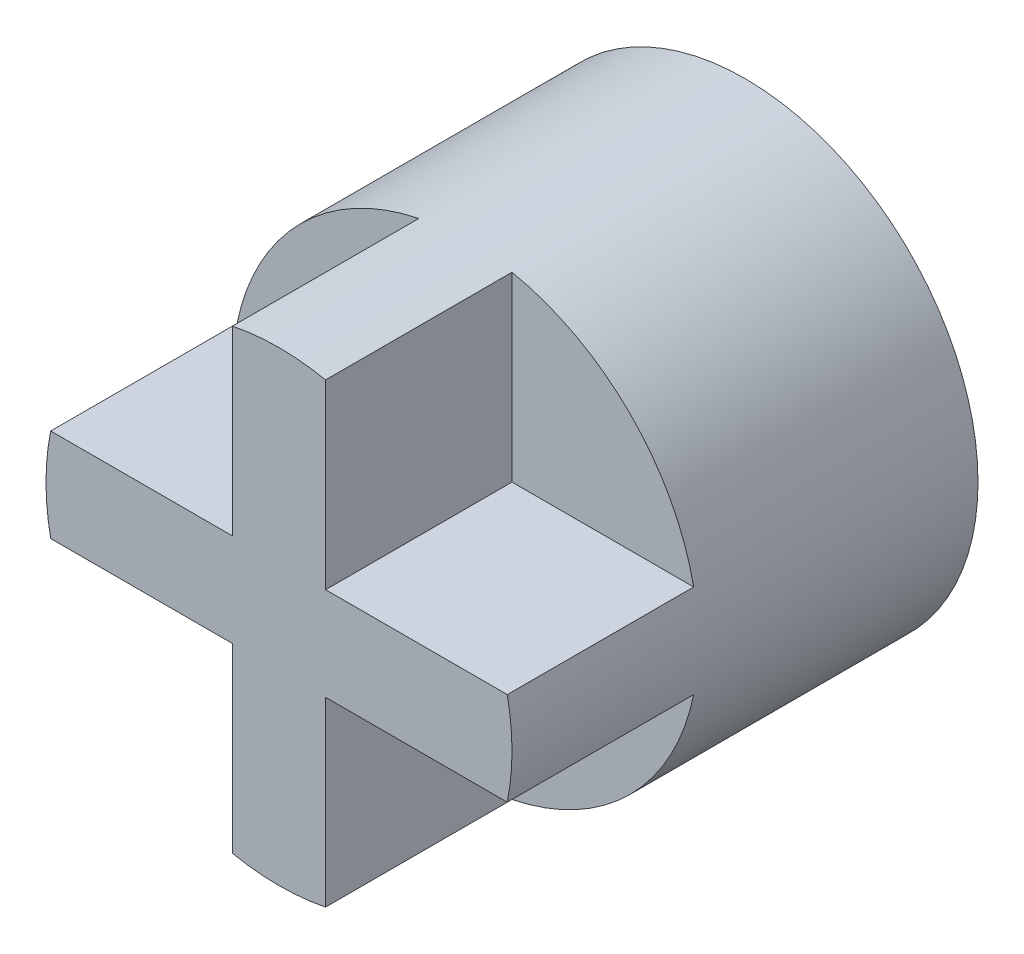
ISO-10303-21;
HEADER;
FILE_DESCRIPTION(('STEP AP214'),'2;1');
FILE_NAME('part.step','',(''),(''),'','','');
FILE_SCHEMA(('AUTOMOTIVE_DESIGN { 1 0 10303 214 1 1 1 1 }'));
ENDSEC;
DATA;
#1=APPLICATION_CONTEXT('core data for automotive mechanical design processes');
#2=APPLICATION_PROTOCOL_DEFINITION('international standard','automotive_design',2000,#1);
#3=PRODUCT_CONTEXT('',#1,'mechanical');
#4=PRODUCT('Part','Part','',(#3));
#5=PRODUCT_RELATED_PRODUCT_CATEGORY('part','',(#4));
#6=PRODUCT_DEFINITION_FORMATION('','',#4);
#7=PRODUCT_DEFINITION_CONTEXT('part definition',#1,'design');
#8=PRODUCT_DEFINITION('design','',#6,#7);
#9=PRODUCT_DEFINITION_SHAPE('','',#8);
#10=(LENGTH_UNIT() NAMED_UNIT(*) SI_UNIT(.MILLI.,.METRE.));
#11=(NAMED_UNIT(*) PLANE_ANGLE_UNIT() SI_UNIT($,.RADIAN.));
#12=(NAMED_UNIT(*) SI_UNIT($,.STERADIAN.) SOLID_ANGLE_UNIT());
#13=UNCERTAINTY_MEASURE_WITH_UNIT(LENGTH_MEASURE(1.E-05),#10,'distance_accuracy_value','');
#14=(GEOMETRIC_REPRESENTATION_CONTEXT(3) GLOBAL_UNCERTAINTY_ASSIGNED_CONTEXT((#13)) GLOBAL_UNIT_ASSIGNED_CONTEXT((#10,
#11,#12)) REPRESENTATION_CONTEXT('',''));
#15=CARTESIAN_POINT('',(0.,0.,0.));
#16=DIRECTION('',(0.,0.,1.));
#17=DIRECTION('',(1.,0.,0.));
#18=AXIS2_PLACEMENT_3D('',#15,#16,#17);
#19=CARTESIAN_POINT('',(0.,0.,7.62));
#20=DIRECTION('',(0.,0.,1.));
#21=DIRECTION('',(1.,0.,0.));
#22=AXIS2_PLACEMENT_3D('',#19,#20,#21);
#23=PLANE('',#22);
#24=DIRECTION('',(0.,1.,0.));
#25=VECTOR('',#24,1.);
#26=CARTESIAN_POINT('',(1.27,0.,7.62));
#27=LINE('',#26,#25);
#28=CARTESIAN_POINT('',(1.27,1.27,7.62));
#29=VERTEX_POINT('',#28);
#30=CARTESIAN_POINT('',(1.27,6.22170394666927,7.62));
#31=VERTEX_POINT('',#30);
#32=EDGE_CURVE('E192',#29,#31,#27,.T.);
#33=ORIENTED_EDGE('',*,*,#32,.F.);
#34=DIRECTION('',(1.,0.,0.));
#35=VECTOR('',#34,1.);
#36=CARTESIAN_POINT('',(0.,1.27,7.62));
#37=LINE('',#36,#35);
#38=CARTESIAN_POINT('',(6.22170394666927,1.27,7.62));
#39=VERTEX_POINT('',#38);
#40=EDGE_CURVE('E143',#29,#39,#37,.T.);
#41=ORIENTED_EDGE('',*,*,#40,.T.);
#42=CARTESIAN_POINT('',(0.,0.,7.62));
#43=DIRECTION('',(0.,0.,1.));
#44=DIRECTION('',(1.,0.,0.));
#45=AXIS2_PLACEMENT_3D('',#42,#43,#44);
#46=CIRCLE('',#45,6.35);
#47=EDGE_CURVE('E11',#39,#31,#46,.T.);
#48=ORIENTED_EDGE('',*,*,#47,.T.);
#49=EDGE_LOOP('',(#33,#41,#48));
#50=FACE_BOUND('',#49,.T.);
#51=ADVANCED_FACE('F41',(#50),#23,.T.);
#52=CARTESIAN_POINT('',(-6.22170394666927,-1.27,7.62));
#53=VERTEX_POINT('',#52);
#54=CARTESIAN_POINT('',(-1.27,-6.22170394666927,7.62));
#55=VERTEX_POINT('',#54);
#56=EDGE_CURVE('E235',#53,#55,#46,.T.);
#57=ORIENTED_EDGE('',*,*,#56,.T.);
#58=DIRECTION('',(0.,1.,0.));
#59=VECTOR('',#58,1.);
#60=CARTESIAN_POINT('',(-1.27,0.,7.62));
#61=LINE('',#60,#59);
#62=CARTESIAN_POINT('',(-1.27,-1.27,7.62));
#63=VERTEX_POINT('',#62);
#64=EDGE_CURVE('E180',#55,#63,#61,.T.);
#65=ORIENTED_EDGE('',*,*,#64,.T.);
#66=DIRECTION('',(1.,0.,0.));
#67=VECTOR('',#66,1.);
#68=CARTESIAN_POINT('',(0.,-1.27,7.62));
#69=LINE('',#68,#67);
#70=EDGE_CURVE('E176',#53,#63,#69,.T.);
#71=ORIENTED_EDGE('',*,*,#70,.F.);
#72=EDGE_LOOP('',(#57,#65,#71));
#73=FACE_BOUND('',#72,.T.);
#74=ADVANCED_FACE('F271',(#73),#23,.T.);
#75=DIRECTION('',(1.,0.,0.));
#76=VECTOR('',#75,1.);
#77=CARTESIAN_POINT('',(0.,1.27,7.62));
#78=LINE('',#77,#76);
#79=CARTESIAN_POINT('',(-6.22170394666927,1.27,7.62));
#80=VERTEX_POINT('',#79);
#81=CARTESIAN_POINT('',(-1.27,1.27,7.62));
#82=VERTEX_POINT('',#81);
#83=EDGE_CURVE('E171',#80,#82,#78,.T.);
#84=ORIENTED_EDGE('',*,*,#83,.T.);
#85=DIRECTION('',(0.,1.,0.));
#86=VECTOR('',#85,1.);
#87=CARTESIAN_POINT('',(-1.27,0.,7.62));
#88=LINE('',#87,#86);
#89=CARTESIAN_POINT('',(-1.27,6.22170394666927,7.62));
#90=VERTEX_POINT('',#89);
#91=EDGE_CURVE('E59',#82,#90,#88,.T.);
#92=ORIENTED_EDGE('',*,*,#91,.T.);
#93=EDGE_CURVE('E51',#90,#80,#46,.T.);
#94=ORIENTED_EDGE('',*,*,#93,.T.);
#95=EDGE_LOOP('',(#84,#92,#94));
#96=FACE_BOUND('',#95,.T.);
#97=ADVANCED_FACE('F249',(#96),#23,.T.);
#98=CARTESIAN_POINT('',(0.,0.,7.62));
#99=DIRECTION('',(0.,0.,-1.));
#100=DIRECTION('',(-1.,0.,0.));
#101=AXIS2_PLACEMENT_3D('',#98,#99,#100);
#102=CYLINDRICAL_SURFACE('',#101,6.35);
#103=ORIENTED_EDGE('',*,*,#47,.F.);
#104=DIRECTION('',(0.,0.,-1.));
#105=VECTOR('',#104,1.);
#106=CARTESIAN_POINT('',(6.22170394666927,1.27,12.7));
#107=LINE('',#106,#105);
#108=CARTESIAN_POINT('',(6.22170394666927,1.27,12.7));
#109=VERTEX_POINT('',#108);
#110=EDGE_CURVE('E147',#109,#39,#107,.T.);
#111=ORIENTED_EDGE('',*,*,#110,.F.);
#112=CARTESIAN_POINT('',(0.,0.,12.7));
#113=DIRECTION('',(0.,0.,1.));
#114=DIRECTION('',(1.,0.,0.));
#115=AXIS2_PLACEMENT_3D('',#112,#113,#114);
#116=CIRCLE('',#115,6.35);
#117=CARTESIAN_POINT('',(6.22170394666927,-1.27,12.7));
#118=VERTEX_POINT('',#117);
#119=EDGE_CURVE('E158',#118,#109,#116,.T.);
#120=ORIENTED_EDGE('',*,*,#119,.F.);
#121=DIRECTION('',(0.,0.,-1.));
#122=VECTOR('',#121,1.);
#123=CARTESIAN_POINT('',(6.22170394666927,-1.27,12.7));
#124=LINE('',#123,#122);
#125=CARTESIAN_POINT('',(6.22170394666927,-1.27,7.62));
#126=VERTEX_POINT('',#125);
#127=EDGE_CURVE('E202',#118,#126,#124,.T.);
#128=ORIENTED_EDGE('',*,*,#127,.T.);
#129=CARTESIAN_POINT('',(1.27,-6.22170394666927,7.62));
#130=VERTEX_POINT('',#129);
#131=EDGE_CURVE('E52',#130,#126,#46,.T.);
#132=ORIENTED_EDGE('',*,*,#131,.F.);
#133=DIRECTION('',(0.,0.,-1.));
#134=VECTOR('',#133,1.);
#135=CARTESIAN_POINT('',(1.27,-6.22170394666927,12.7));
#136=LINE('',#135,#134);
#137=CARTESIAN_POINT('',(1.27,-6.22170394666927,12.7));
#138=VERTEX_POINT('',#137);
#139=EDGE_CURVE('E210',#138,#130,#136,.T.);
#140=ORIENTED_EDGE('',*,*,#139,.F.);
#141=CARTESIAN_POINT('',(0.,0.,12.7));
#142=DIRECTION('',(0.,0.,1.));
#143=DIRECTION('',(1.,0.,0.));
#144=AXIS2_PLACEMENT_3D('',#141,#142,#143);
#145=CIRCLE('',#144,6.35);
#146=CARTESIAN_POINT('',(-1.27,-6.22170394666927,12.7));
#147=VERTEX_POINT('',#146);
#148=EDGE_CURVE('E423',#147,#138,#145,.T.);
#149=ORIENTED_EDGE('',*,*,#148,.F.);
#150=DIRECTION('',(0.,0.,-1.));
#151=VECTOR('',#150,1.);
#152=CARTESIAN_POINT('',(-1.27,-6.22170394666927,12.7));
#153=LINE('',#152,#151);
#154=EDGE_CURVE('E213',#147,#55,#153,.T.);
#155=ORIENTED_EDGE('',*,*,#154,.T.);
#156=ORIENTED_EDGE('',*,*,#56,.F.);
#157=DIRECTION('',(0.,0.,-1.));
#158=VECTOR('',#157,1.);
#159=CARTESIAN_POINT('',(-6.22170394666927,-1.27,12.7));
#160=LINE('',#159,#158);
#161=CARTESIAN_POINT('',(-6.22170394666927,-1.27,12.7));
#162=VERTEX_POINT('',#161);
#163=EDGE_CURVE('E219',#162,#53,#160,.T.);
#164=ORIENTED_EDGE('',*,*,#163,.F.);
#165=CARTESIAN_POINT('',(0.,0.,12.7));
#166=DIRECTION('',(0.,0.,1.));
#167=DIRECTION('',(1.,0.,0.));
#168=AXIS2_PLACEMENT_3D('',#165,#166,#167);
#169=CIRCLE('',#168,6.35);
#170=CARTESIAN_POINT('',(-6.22170394666927,1.27,12.7));
#171=VERTEX_POINT('',#170);
#172=EDGE_CURVE('E254',#171,#162,#169,.T.);
#173=ORIENTED_EDGE('',*,*,#172,.F.);
#174=DIRECTION('',(0.,0.,-1.));
#175=VECTOR('',#174,1.);
#176=CARTESIAN_POINT('',(-6.22170394666927,1.27,12.7));
#177=LINE('',#176,#175);
#178=EDGE_CURVE('E222',#171,#80,#177,.T.);
#179=ORIENTED_EDGE('',*,*,#178,.T.);
#180=ORIENTED_EDGE('',*,*,#93,.F.);
#181=DIRECTION('',(0.,0.,-1.));
#182=VECTOR('',#181,1.);
#183=CARTESIAN_POINT('',(-1.27,6.22170394666927,12.7));
#184=LINE('',#183,#182);
#185=CARTESIAN_POINT('',(-1.27,6.22170394666927,12.7));
#186=VERTEX_POINT('',#185);
#187=EDGE_CURVE('E106',#186,#90,#184,.T.);
#188=ORIENTED_EDGE('',*,*,#187,.F.);
#189=CARTESIAN_POINT('',(0.,0.,12.7));
#190=DIRECTION('',(0.,0.,1.));
#191=DIRECTION('',(1.,0.,0.));
#192=AXIS2_PLACEMENT_3D('',#189,#190,#191);
#193=CIRCLE('',#192,6.35);
#194=CARTESIAN_POINT('',(1.27,6.22170394666927,12.7));
#195=VERTEX_POINT('',#194);
#196=EDGE_CURVE('E68',#195,#186,#193,.T.);
#197=ORIENTED_EDGE('',*,*,#196,.F.);
#198=DIRECTION('',(0.,0.,-1.));
#199=VECTOR('',#198,1.);
#200=CARTESIAN_POINT('',(1.27,6.22170394666927,12.7));
#201=LINE('',#200,#199);
#202=EDGE_CURVE('E148',#195,#31,#201,.T.);
#203=ORIENTED_EDGE('',*,*,#202,.T.);
#204=EDGE_LOOP('',(#103,#111,#120,#128,#132,#140,#149,#155,#156,#164,#173,#179,#180,#188,#197,#203));
#205=FACE_BOUND('',#204,.T.);
#206=CARTESIAN_POINT('',(0.,0.,0.));
#207=DIRECTION('',(0.,0.,1.));
#208=DIRECTION('',(1.,0.,0.));
#209=AXIS2_PLACEMENT_3D('',#206,#207,#208);
#210=CIRCLE('',#209,6.35);
#211=CARTESIAN_POINT('',(6.35,0.,0.));
#212=VERTEX_POINT('',#211);
#213=EDGE_CURVE('E45',#212,#212,#210,.T.);
#214=ORIENTED_EDGE('',*,*,#213,.T.);
#215=EDGE_LOOP('',(#214));
#216=FACE_BOUND('',#215,.T.);
#217=ADVANCED_FACE('F43',(#205,#216),#102,.T.);
#218=DIRECTION('',(1.,0.,0.));
#219=VECTOR('',#218,1.);
#220=CARTESIAN_POINT('',(0.,-1.27,7.62));
#221=LINE('',#220,#219);
#222=CARTESIAN_POINT('',(1.27,-1.27,7.62));
#223=VERTEX_POINT('',#222);
#224=EDGE_CURVE('E187',#223,#126,#221,.T.);
#225=ORIENTED_EDGE('',*,*,#224,.F.);
#226=DIRECTION('',(0.,1.,0.));
#227=VECTOR('',#226,1.);
#228=CARTESIAN_POINT('',(1.27,0.,7.62));
#229=LINE('',#228,#227);
#230=EDGE_CURVE('E184',#130,#223,#229,.T.);
#231=ORIENTED_EDGE('',*,*,#230,.F.);
#232=ORIENTED_EDGE('',*,*,#131,.T.);
#233=EDGE_LOOP('',(#225,#231,#232));
#234=FACE_BOUND('',#233,.T.);
#235=ADVANCED_FACE('F274',(#234),#23,.T.);
#236=CARTESIAN_POINT('',(0.,0.,0.));
#237=DIRECTION('',(0.,0.,1.));
#238=DIRECTION('',(1.,0.,0.));
#239=AXIS2_PLACEMENT_3D('',#236,#237,#238);
#240=PLANE('',#239);
#241=CARTESIAN_POINT('',(0.,0.,0.));
#242=DIRECTION('',(0.,0.,-1.));
#243=DIRECTION('',(-1.,0.,0.));
#244=AXIS2_PLACEMENT_3D('',#241,#242,#243);
#245=CIRCLE('',#244,3.048);
#246=CARTESIAN_POINT('',(-3.048,0.,0.));
#247=VERTEX_POINT('',#246);
#248=EDGE_CURVE('E403',#247,#247,#245,.T.);
#249=ORIENTED_EDGE('',*,*,#248,.F.);
#250=EDGE_LOOP('',(#249));
#251=FACE_BOUND('',#250,.T.);
#252=ORIENTED_EDGE('',*,*,#213,.F.);
#253=EDGE_LOOP('',(#252));
#254=FACE_BOUND('',#253,.T.);
#255=ADVANCED_FACE('F268',(#251,#254),#240,.F.);
#256=CARTESIAN_POINT('',(-1.27,0.,12.7));
#257=DIRECTION('',(-1.,0.,0.));
#258=DIRECTION('',(0.,0.,1.));
#259=AXIS2_PLACEMENT_3D('',#256,#257,#258);
#260=PLANE('',#259);
#261=ORIENTED_EDGE('',*,*,#91,.F.);
#262=DIRECTION('',(0.,0.,-1.));
#263=VECTOR('',#262,1.);
#264=CARTESIAN_POINT('',(-1.27,1.27,12.7));
#265=LINE('',#264,#263);
#266=CARTESIAN_POINT('',(-1.27,1.27,12.7));
#267=VERTEX_POINT('',#266);
#268=EDGE_CURVE('E109',#267,#82,#265,.T.);
#269=ORIENTED_EDGE('',*,*,#268,.F.);
#270=DIRECTION('',(0.,1.,0.));
#271=VECTOR('',#270,1.);
#272=CARTESIAN_POINT('',(-1.27,0.,12.7));
#273=LINE('',#272,#271);
#274=EDGE_CURVE('E195',#267,#186,#273,.T.);
#275=ORIENTED_EDGE('',*,*,#274,.T.);
#276=ORIENTED_EDGE('',*,*,#187,.T.);
#277=EDGE_LOOP('',(#261,#269,#275,#276));
#278=FACE_BOUND('',#277,.T.);
#279=ADVANCED_FACE('F259',(#278),#260,.T.);
#280=CARTESIAN_POINT('',(0.,1.27,12.7));
#281=DIRECTION('',(0.,1.,0.));
#282=DIRECTION('',(0.,0.,1.));
#283=AXIS2_PLACEMENT_3D('',#280,#281,#282);
#284=PLANE('',#283);
#285=ORIENTED_EDGE('',*,*,#83,.F.);
#286=ORIENTED_EDGE('',*,*,#178,.F.);
#287=DIRECTION('',(1.,0.,0.));
#288=VECTOR('',#287,1.);
#289=CARTESIAN_POINT('',(0.,1.27,12.7));
#290=LINE('',#289,#288);
#291=EDGE_CURVE('E411',#171,#267,#290,.T.);
#292=ORIENTED_EDGE('',*,*,#291,.T.);
#293=ORIENTED_EDGE('',*,*,#268,.T.);
#294=EDGE_LOOP('',(#285,#286,#292,#293));
#295=FACE_BOUND('',#294,.T.);
#296=ADVANCED_FACE('F256',(#295),#284,.T.);
#297=CARTESIAN_POINT('',(0.,-1.27,12.7));
#298=DIRECTION('',(0.,1.,0.));
#299=DIRECTION('',(0.,0.,1.));
#300=AXIS2_PLACEMENT_3D('',#297,#298,#299);
#301=PLANE('',#300);
#302=ORIENTED_EDGE('',*,*,#70,.T.);
#303=DIRECTION('',(0.,0.,-1.));
#304=VECTOR('',#303,1.);
#305=CARTESIAN_POINT('',(-1.27,-1.27,12.7));
#306=LINE('',#305,#304);
#307=CARTESIAN_POINT('',(-1.27,-1.27,12.7));
#308=VERTEX_POINT('',#307);
#309=EDGE_CURVE('E216',#308,#63,#306,.T.);
#310=ORIENTED_EDGE('',*,*,#309,.F.);
#311=DIRECTION('',(1.,0.,0.));
#312=VECTOR('',#311,1.);
#313=CARTESIAN_POINT('',(0.,-1.27,12.7));
#314=LINE('',#313,#312);
#315=EDGE_CURVE('E416',#162,#308,#314,.T.);
#316=ORIENTED_EDGE('',*,*,#315,.F.);
#317=ORIENTED_EDGE('',*,*,#163,.T.);
#318=EDGE_LOOP('',(#302,#310,#316,#317));
#319=FACE_BOUND('',#318,.T.);
#320=ADVANCED_FACE('F258',(#319),#301,.F.);
#321=CARTESIAN_POINT('',(-1.27,0.,12.7));
#322=DIRECTION('',(-1.,0.,0.));
#323=DIRECTION('',(0.,0.,1.));
#324=AXIS2_PLACEMENT_3D('',#321,#322,#323);
#325=PLANE('',#324);
#326=ORIENTED_EDGE('',*,*,#64,.F.);
#327=ORIENTED_EDGE('',*,*,#154,.F.);
#328=DIRECTION('',(0.,1.,0.));
#329=VECTOR('',#328,1.);
#330=CARTESIAN_POINT('',(-1.27,0.,12.7));
#331=LINE('',#330,#329);
#332=EDGE_CURVE('E419',#147,#308,#331,.T.);
#333=ORIENTED_EDGE('',*,*,#332,.T.);
#334=ORIENTED_EDGE('',*,*,#309,.T.);
#335=EDGE_LOOP('',(#326,#327,#333,#334));
#336=FACE_BOUND('',#335,.T.);
#337=ADVANCED_FACE('F265',(#336),#325,.T.);
#338=CARTESIAN_POINT('',(1.27,0.,12.7));
#339=DIRECTION('',(-1.,0.,0.));
#340=DIRECTION('',(0.,0.,1.));
#341=AXIS2_PLACEMENT_3D('',#338,#339,#340);
#342=PLANE('',#341);
#343=ORIENTED_EDGE('',*,*,#230,.T.);
#344=DIRECTION('',(0.,0.,-1.));
#345=VECTOR('',#344,1.);
#346=CARTESIAN_POINT('',(1.27,-1.27,12.7));
#347=LINE('',#346,#345);
#348=CARTESIAN_POINT('',(1.27,-1.27,12.7));
#349=VERTEX_POINT('',#348);
#350=EDGE_CURVE('E206',#349,#223,#347,.T.);
#351=ORIENTED_EDGE('',*,*,#350,.F.);
#352=DIRECTION('',(0.,1.,0.));
#353=VECTOR('',#352,1.);
#354=CARTESIAN_POINT('',(1.27,0.,12.7));
#355=LINE('',#354,#353);
#356=EDGE_CURVE('E426',#138,#349,#355,.T.);
#357=ORIENTED_EDGE('',*,*,#356,.F.);
#358=ORIENTED_EDGE('',*,*,#139,.T.);
#359=EDGE_LOOP('',(#343,#351,#357,#358));
#360=FACE_BOUND('',#359,.T.);
#361=ADVANCED_FACE('F325',(#360),#342,.F.);
#362=CARTESIAN_POINT('',(0.,-1.27,12.7));
#363=DIRECTION('',(0.,1.,0.));
#364=DIRECTION('',(0.,0.,1.));
#365=AXIS2_PLACEMENT_3D('',#362,#363,#364);
#366=PLANE('',#365);
#367=ORIENTED_EDGE('',*,*,#224,.T.);
#368=ORIENTED_EDGE('',*,*,#127,.F.);
#369=DIRECTION('',(1.,0.,0.));
#370=VECTOR('',#369,1.);
#371=CARTESIAN_POINT('',(0.,-1.27,12.7));
#372=LINE('',#371,#370);
#373=EDGE_CURVE('E163',#349,#118,#372,.T.);
#374=ORIENTED_EDGE('',*,*,#373,.F.);
#375=ORIENTED_EDGE('',*,*,#350,.T.);
#376=EDGE_LOOP('',(#367,#368,#374,#375));
#377=FACE_BOUND('',#376,.T.);
#378=ADVANCED_FACE('F335',(#377),#366,.F.);
#379=CARTESIAN_POINT('',(0.,1.27,12.7));
#380=DIRECTION('',(0.,1.,0.));
#381=DIRECTION('',(0.,0.,1.));
#382=AXIS2_PLACEMENT_3D('',#379,#380,#381);
#383=PLANE('',#382);
#384=ORIENTED_EDGE('',*,*,#40,.F.);
#385=DIRECTION('',(0.,0.,-1.));
#386=VECTOR('',#385,1.);
#387=CARTESIAN_POINT('',(1.27,1.27,12.7));
#388=LINE('',#387,#386);
#389=CARTESIAN_POINT('',(1.27,1.27,12.7));
#390=VERTEX_POINT('',#389);
#391=EDGE_CURVE('E137',#390,#29,#388,.T.);
#392=ORIENTED_EDGE('',*,*,#391,.F.);
#393=DIRECTION('',(1.,0.,0.));
#394=VECTOR('',#393,1.);
#395=CARTESIAN_POINT('',(0.,1.27,12.7));
#396=LINE('',#395,#394);
#397=EDGE_CURVE('E141',#390,#109,#396,.T.);
#398=ORIENTED_EDGE('',*,*,#397,.T.);
#399=ORIENTED_EDGE('',*,*,#110,.T.);
#400=EDGE_LOOP('',(#384,#392,#398,#399));
#401=FACE_BOUND('',#400,.T.);
#402=ADVANCED_FACE('F139',(#401),#383,.T.);
#403=CARTESIAN_POINT('',(1.27,0.,12.7));
#404=DIRECTION('',(-1.,0.,0.));
#405=DIRECTION('',(0.,0.,1.));
#406=AXIS2_PLACEMENT_3D('',#403,#404,#405);
#407=PLANE('',#406);
#408=ORIENTED_EDGE('',*,*,#32,.T.);
#409=ORIENTED_EDGE('',*,*,#202,.F.);
#410=DIRECTION('',(0.,1.,0.));
#411=VECTOR('',#410,1.);
#412=CARTESIAN_POINT('',(1.27,0.,12.7));
#413=LINE('',#412,#411);
#414=EDGE_CURVE('E151',#390,#195,#413,.T.);
#415=ORIENTED_EDGE('',*,*,#414,.F.);
#416=ORIENTED_EDGE('',*,*,#391,.T.);
#417=EDGE_LOOP('',(#408,#409,#415,#416));
#418=FACE_BOUND('',#417,.T.);
#419=ADVANCED_FACE('F152',(#418),#407,.F.);
#420=CARTESIAN_POINT('',(0.,0.,12.7));
#421=DIRECTION('',(0.,0.,1.));
#422=DIRECTION('',(1.,0.,0.));
#423=AXIS2_PLACEMENT_3D('',#420,#421,#422);
#424=PLANE('',#423);
#425=ORIENTED_EDGE('',*,*,#274,.F.);
#426=ORIENTED_EDGE('',*,*,#291,.F.);
#427=ORIENTED_EDGE('',*,*,#172,.T.);
#428=ORIENTED_EDGE('',*,*,#315,.T.);
#429=ORIENTED_EDGE('',*,*,#332,.F.);
#430=ORIENTED_EDGE('',*,*,#148,.T.);
#431=ORIENTED_EDGE('',*,*,#356,.T.);
#432=ORIENTED_EDGE('',*,*,#373,.T.);
#433=ORIENTED_EDGE('',*,*,#119,.T.);
#434=ORIENTED_EDGE('',*,*,#397,.F.);
#435=ORIENTED_EDGE('',*,*,#414,.T.);
#436=ORIENTED_EDGE('',*,*,#196,.T.);
#437=EDGE_LOOP('',(#425,#426,#427,#428,#429,#430,#431,#432,#433,#434,#435,#436));
#438=FACE_BOUND('',#437,.T.);
#439=ADVANCED_FACE('F156',(#438),#424,.T.);
#440=CARTESIAN_POINT('',(0.,0.,3.81));
#441=DIRECTION('',(0.,0.,-1.));
#442=DIRECTION('',(-1.,0.,0.));
#443=AXIS2_PLACEMENT_3D('',#440,#441,#442);
#444=CYLINDRICAL_SURFACE('',#443,3.048);
#445=CARTESIAN_POINT('',(0.,0.,3.81));
#446=DIRECTION('',(0.,0.,-1.));
#447=DIRECTION('',(-1.,0.,0.));
#448=AXIS2_PLACEMENT_3D('',#445,#446,#447);
#449=CIRCLE('',#448,3.048);
#450=CARTESIAN_POINT('',(-3.048,0.,3.81));
#451=VERTEX_POINT('',#450);
#452=EDGE_CURVE('E172',#451,#451,#449,.T.);
#453=CARTESIAN_POINT('',(-3.048,0.,3.81));
#454=CARTESIAN_POINT('',(-3.048,0.,3.7703125));
#455=CARTESIAN_POINT('',(-3.048,0.,3.730625));
#456=CARTESIAN_POINT('',(-3.048,0.,3.65125));
#457=CARTESIAN_POINT('',(-3.048,0.,3.6115625));
#458=CARTESIAN_POINT('',(-3.048,0.,3.5321875));
#459=CARTESIAN_POINT('',(-3.048,0.,3.4925));
#460=CARTESIAN_POINT('',(-3.048,0.,3.413125));
#461=CARTESIAN_POINT('',(-3.048,0.,3.3734375));
#462=CARTESIAN_POINT('',(-3.048,0.,3.2940625));
#463=CARTESIAN_POINT('',(-3.048,0.,3.254375));
#464=CARTESIAN_POINT('',(-3.048,0.,3.175));
#465=CARTESIAN_POINT('',(-3.048,0.,3.1353125));
#466=CARTESIAN_POINT('',(-3.048,0.,3.0559375));
#467=CARTESIAN_POINT('',(-3.048,0.,3.01625));
#468=CARTESIAN_POINT('',(-3.048,0.,2.936875));
#469=CARTESIAN_POINT('',(-3.048,0.,2.8971875));
#470=CARTESIAN_POINT('',(-3.048,0.,2.8178125));
#471=CARTESIAN_POINT('',(-3.048,0.,2.778125));
#472=CARTESIAN_POINT('',(-3.048,0.,2.69875));
#473=CARTESIAN_POINT('',(-3.048,0.,2.6590625));
#474=CARTESIAN_POINT('',(-3.048,0.,2.5796875));
#475=CARTESIAN_POINT('',(-3.048,0.,2.54));
#476=CARTESIAN_POINT('',(-3.048,0.,2.460625));
#477=CARTESIAN_POINT('',(-3.048,0.,2.4209375));
#478=CARTESIAN_POINT('',(-3.048,0.,2.3415625));
#479=CARTESIAN_POINT('',(-3.048,0.,2.301875));
#480=CARTESIAN_POINT('',(-3.048,0.,2.2225));
#481=CARTESIAN_POINT('',(-3.048,0.,2.1828125));
#482=CARTESIAN_POINT('',(-3.048,0.,2.1034375));
#483=CARTESIAN_POINT('',(-3.048,0.,2.06375));
#484=CARTESIAN_POINT('',(-3.048,0.,1.984375));
#485=CARTESIAN_POINT('',(-3.048,0.,1.9446875));
#486=CARTESIAN_POINT('',(-3.048,0.,1.8653125));
#487=CARTESIAN_POINT('',(-3.048,0.,1.825625));
#488=CARTESIAN_POINT('',(-3.048,0.,1.74625));
#489=CARTESIAN_POINT('',(-3.048,0.,1.7065625));
#490=CARTESIAN_POINT('',(-3.048,0.,1.6271875));
#491=CARTESIAN_POINT('',(-3.048,0.,1.5875));
#492=CARTESIAN_POINT('',(-3.048,0.,1.508125));
#493=CARTESIAN_POINT('',(-3.048,0.,1.4684375));
#494=CARTESIAN_POINT('',(-3.048,0.,1.3890625));
#495=CARTESIAN_POINT('',(-3.048,0.,1.349375));
#496=CARTESIAN_POINT('',(-3.048,0.,1.27));
#497=CARTESIAN_POINT('',(-3.048,0.,1.2303125));
#498=CARTESIAN_POINT('',(-3.048,0.,1.1509375));
#499=CARTESIAN_POINT('',(-3.048,0.,1.11125));
#500=CARTESIAN_POINT('',(-3.048,0.,1.031875));
#501=CARTESIAN_POINT('',(-3.048,0.,0.9921875));
#502=CARTESIAN_POINT('',(-3.048,0.,0.9128125));
#503=CARTESIAN_POINT('',(-3.048,0.,0.873125));
#504=CARTESIAN_POINT('',(-3.048,0.,0.79375));
#505=CARTESIAN_POINT('',(-3.048,0.,0.7540625));
#506=CARTESIAN_POINT('',(-3.048,0.,0.6746875));
#507=CARTESIAN_POINT('',(-3.048,0.,0.635));
#508=CARTESIAN_POINT('',(-3.048,0.,0.555625));
#509=CARTESIAN_POINT('',(-3.048,0.,0.5159375));
#510=CARTESIAN_POINT('',(-3.048,0.,0.4365625));
#511=CARTESIAN_POINT('',(-3.048,0.,0.396875));
#512=CARTESIAN_POINT('',(-3.048,0.,0.3175));
#513=CARTESIAN_POINT('',(-3.048,0.,0.2778125));
#514=CARTESIAN_POINT('',(-3.048,0.,0.1984375));
#515=CARTESIAN_POINT('',(-3.048,0.,0.15875));
#516=CARTESIAN_POINT('',(-3.048,0.,0.0793749999999999));
#517=CARTESIAN_POINT('',(-3.048,0.,0.0396874999999999));
#518=CARTESIAN_POINT('',(-3.048,0.,0.));
#519=B_SPLINE_CURVE_WITH_KNOTS('',3,(#453,#454,#455,#456,#457,#458,#459,#460,#461,#462,#463,
#464,#465,#466,#467,#468,#469,#470,#471,#472,#473,#474,#475,#476,#477,#478,#479,#480,#481,#482,
#483,#484,#485,#486,#487,#488,#489,#490,#491,#492,#493,#494,#495,#496,#497,#498,#499,#500,#501,
#502,#503,#504,#505,#506,#507,#508,#509,#510,#511,#512,#513,#514,#515,#516,#517,#518),
.UNSPECIFIED.,.F.,.F.,(4,2,2,2,2,2,2,2,2,2,2,2,2,2,2,2,2,2,2,2,2,2,2,2,2,2,2,2,2,2,2,2,4),(0.,
0.1190625,0.238125,0.3571875,0.47625,0.5953125,0.714375,0.833437499999999,0.9525,1.0715625,
1.190625,1.3096875,1.42875,1.5478125,1.666875,1.7859375,1.905,2.0240625,2.143125,2.2621875,
2.38125,2.5003125,2.619375,2.7384375,2.8575,2.9765625,3.095625,3.2146875,3.33375,3.4528125,
3.571875,3.6909375,3.81),.UNSPECIFIED.);
#520=EDGE_CURVE('BSEAM371',#451,#247,#519,.T.);
#521=ORIENTED_EDGE('',*,*,#452,.F.);
#522=ORIENTED_EDGE('',*,*,#248,.T.);
#523=ORIENTED_EDGE('',*,*,#520,.T.);
#524=ORIENTED_EDGE('',*,*,#520,.F.);
#525=EDGE_LOOP('',(#521,#523,#522,#524));
#526=FACE_BOUND('',#525,.T.);
#527=ADVANCED_FACE('F371',(#526),#444,.F.);
#528=CARTESIAN_POINT('',(0.,0.,3.81));
#529=DIRECTION('',(0.,0.,-1.));
#530=DIRECTION('',(-1.,0.,0.));
#531=AXIS2_PLACEMENT_3D('',#528,#529,#530);
#532=PLANE('',#531);
#533=ORIENTED_EDGE('',*,*,#452,.T.);
#534=EDGE_LOOP('',(#533));
#535=FACE_BOUND('',#534,.T.);
#536=ADVANCED_FACE('F386',(#535),#532,.T.);
#537=CLOSED_SHELL('',(#51,#74,#97,#217,#235,#255,#279,#296,#320,#337,#361,#378,#402,#419,#439,
#527,#536));
#538=MANIFOLD_SOLID_BREP('B2',#537);
#539=ADVANCED_BREP_SHAPE_REPRESENTATION('',(#18,#538),#14);
#540=SHAPE_DEFINITION_REPRESENTATION(#9,#539);
ENDSEC;
END-ISO-10303-21;
